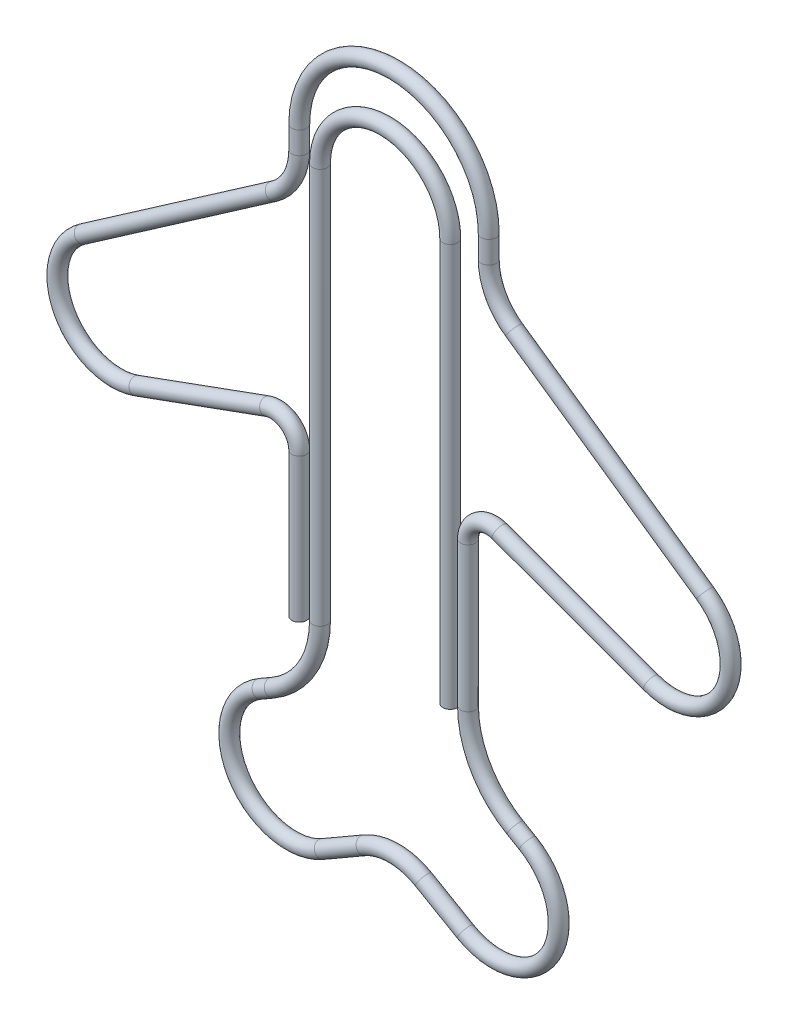
ISO-10303-21;
HEADER;
FILE_DESCRIPTION(('STEP AP214'),'2;1');
FILE_NAME('part.step','',(''),(''),'','','');
FILE_SCHEMA(('AUTOMOTIVE_DESIGN { 1 0 10303 214 1 1 1 1 }'));
ENDSEC;
DATA;
#1=APPLICATION_CONTEXT('core data for automotive mechanical design processes');
#2=APPLICATION_PROTOCOL_DEFINITION('international standard','automotive_design',2000,#1);
#3=PRODUCT_CONTEXT('',#1,'mechanical');
#4=PRODUCT('Part','Part','',(#3));
#5=PRODUCT_RELATED_PRODUCT_CATEGORY('part','',(#4));
#6=PRODUCT_DEFINITION_FORMATION('','',#4);
#7=PRODUCT_DEFINITION_CONTEXT('part definition',#1,'design');
#8=PRODUCT_DEFINITION('design','',#6,#7);
#9=PRODUCT_DEFINITION_SHAPE('','',#8);
#10=(LENGTH_UNIT() NAMED_UNIT(*) SI_UNIT(.MILLI.,.METRE.));
#11=(NAMED_UNIT(*) PLANE_ANGLE_UNIT() SI_UNIT($,.RADIAN.));
#12=(NAMED_UNIT(*) SI_UNIT($,.STERADIAN.) SOLID_ANGLE_UNIT());
#13=UNCERTAINTY_MEASURE_WITH_UNIT(LENGTH_MEASURE(1.E-05),#10,'distance_accuracy_value','');
#14=(GEOMETRIC_REPRESENTATION_CONTEXT(3) GLOBAL_UNCERTAINTY_ASSIGNED_CONTEXT((#13)) GLOBAL_UNIT_ASSIGNED_CONTEXT((#10,
#11,#12)) REPRESENTATION_CONTEXT('',''));
#15=CARTESIAN_POINT('',(0.,0.,0.));
#16=DIRECTION('',(0.,0.,1.));
#17=DIRECTION('',(1.,0.,0.));
#18=AXIS2_PLACEMENT_3D('',#15,#16,#17);
#19=CARTESIAN_POINT('',(-16.0000000000002,12.2874079730314,0.));
#20=DIRECTION('',(0.,-1.,0.));
#21=DIRECTION('',(1.,0.,0.));
#22=AXIS2_PLACEMENT_3D('',#19,#20,#21);
#23=CYLINDRICAL_SURFACE('',#22,1.25);
#24=CARTESIAN_POINT('',(-16.0000000000002,12.2874079730314,0.));
#25=DIRECTION('',(0.,1.,0.));
#26=DIRECTION('',(-1.,0.,0.));
#27=AXIS2_PLACEMENT_3D('',#24,#25,#26);
#28=CIRCLE('',#27,1.25);
#29=CARTESIAN_POINT('',(-14.7500000000002,12.2874079730314,0.));
#30=VERTEX_POINT('',#29);
#31=EDGE_CURVE('E39',#30,#30,#28,.T.);
#32=CARTESIAN_POINT('',(-16.,-12.0000000000001,0.));
#33=DIRECTION('',(0.,1.,0.));
#34=DIRECTION('',(-1.,0.,0.));
#35=AXIS2_PLACEMENT_3D('',#32,#33,#34);
#36=CIRCLE('',#35,1.25);
#37=CARTESIAN_POINT('',(-14.75,-12.0000000000002,0.));
#38=VERTEX_POINT('',#37);
#39=EDGE_CURVE('E10',#38,#38,#36,.T.);
#40=CARTESIAN_POINT('',(-14.7500000000002,12.2874079730314,0.));
#41=CARTESIAN_POINT('',(-14.7500000000002,12.034414139979,0.));
#42=CARTESIAN_POINT('',(-14.7500000000002,11.7814203069265,0.));
#43=CARTESIAN_POINT('',(-14.7500000000002,11.2754326408217,0.));
#44=CARTESIAN_POINT('',(-14.7500000000002,11.0224388077693,0.));
#45=CARTESIAN_POINT('',(-14.7500000000002,10.5164511416645,0.));
#46=CARTESIAN_POINT('',(-14.7500000000002,10.2634573086121,0.));
#47=CARTESIAN_POINT('',(-14.7500000000001,9.75746964250725,0.));
#48=CARTESIAN_POINT('',(-14.7500000000001,9.50447580945484,0.));
#49=CARTESIAN_POINT('',(-14.7500000000001,8.99848814335001,0.));
#50=CARTESIAN_POINT('',(-14.7500000000001,8.7454943102976,0.));
#51=CARTESIAN_POINT('',(-14.7500000000001,8.23950664419278,0.));
#52=CARTESIAN_POINT('',(-14.7500000000001,7.98651281114036,0.));
#53=CARTESIAN_POINT('',(-14.7500000000001,7.48052514503554,0.));
#54=CARTESIAN_POINT('',(-14.7500000000001,7.22753131198313,0.));
#55=CARTESIAN_POINT('',(-14.7500000000001,6.7215436458783,0.));
#56=CARTESIAN_POINT('',(-14.7500000000001,6.46854981282589,0.));
#57=CARTESIAN_POINT('',(-14.7500000000001,5.96256214672106,0.));
#58=CARTESIAN_POINT('',(-14.7500000000001,5.70956831366865,0.));
#59=CARTESIAN_POINT('',(-14.7500000000001,5.20358064756383,0.));
#60=CARTESIAN_POINT('',(-14.7500000000001,4.95058681451142,0.));
#61=CARTESIAN_POINT('',(-14.7500000000001,4.44459914840659,0.));
#62=CARTESIAN_POINT('',(-14.7500000000001,4.19160531535418,0.));
#63=CARTESIAN_POINT('',(-14.7500000000001,3.68561764924935,0.));
#64=CARTESIAN_POINT('',(-14.7500000000001,3.43262381619694,0.));
#65=CARTESIAN_POINT('',(-14.7500000000001,2.92663615009212,0.));
#66=CARTESIAN_POINT('',(-14.7500000000001,2.6736423170397,0.));
#67=CARTESIAN_POINT('',(-14.7500000000001,2.16765465093488,0.));
#68=CARTESIAN_POINT('',(-14.7500000000001,1.91466081788247,0.));
#69=CARTESIAN_POINT('',(-14.7500000000001,1.40867315177764,0.));
#70=CARTESIAN_POINT('',(-14.7500000000001,1.15567931872523,0.));
#71=CARTESIAN_POINT('',(-14.7500000000001,0.649691652620404,0.));
#72=CARTESIAN_POINT('',(-14.7500000000001,0.396697819567992,0.));
#73=CARTESIAN_POINT('',(-14.7500000000001,-0.109289846536833,0.));
#74=CARTESIAN_POINT('',(-14.7500000000001,-0.362283679589245,0.));
#75=CARTESIAN_POINT('',(-14.7500000000001,-0.86827134569407,0.));
#76=CARTESIAN_POINT('',(-14.7500000000001,-1.12126517874648,0.));
#77=CARTESIAN_POINT('',(-14.7500000000001,-1.62725284485131,0.));
#78=CARTESIAN_POINT('',(-14.7500000000001,-1.88024667790372,0.));
#79=CARTESIAN_POINT('',(-14.7500000000001,-2.38623434400854,0.));
#80=CARTESIAN_POINT('',(-14.7500000000001,-2.63922817706096,0.));
#81=CARTESIAN_POINT('',(-14.7500000000001,-3.14521584316578,0.));
#82=CARTESIAN_POINT('',(-14.7500000000001,-3.39820967621819,0.));
#83=CARTESIAN_POINT('',(-14.7500000000001,-3.90419734232301,0.));
#84=CARTESIAN_POINT('',(-14.7500000000001,-4.15719117537543,0.));
#85=CARTESIAN_POINT('',(-14.7500000000001,-4.66317884148025,0.));
#86=CARTESIAN_POINT('',(-14.7500000000001,-4.91617267453267,0.));
#87=CARTESIAN_POINT('',(-14.7500000000001,-5.42216034063749,0.));
#88=CARTESIAN_POINT('',(-14.7500000000001,-5.6751541736899,0.));
#89=CARTESIAN_POINT('',(-14.7500000000001,-6.18114183979473,0.));
#90=CARTESIAN_POINT('',(-14.7500000000001,-6.43413567284714,0.));
#91=CARTESIAN_POINT('',(-14.7500000000001,-6.94012333895196,0.));
#92=CARTESIAN_POINT('',(-14.7500000000001,-7.19311717200438,0.));
#93=CARTESIAN_POINT('',(-14.7500000000001,-7.6991048381092,0.));
#94=CARTESIAN_POINT('',(-14.7500000000001,-7.95209867116161,0.));
#95=CARTESIAN_POINT('',(-14.7500000000001,-8.45808633726644,0.));
#96=CARTESIAN_POINT('',(-14.7500000000001,-8.71108017031885,0.));
#97=CARTESIAN_POINT('',(-14.75,-9.21706783642367,0.));
#98=CARTESIAN_POINT('',(-14.75,-9.47006166947609,0.));
#99=CARTESIAN_POINT('',(-14.75,-9.97604933558091,0.));
#100=CARTESIAN_POINT('',(-14.75,-10.2290431686333,0.));
#101=CARTESIAN_POINT('',(-14.75,-10.7350308347381,0.));
#102=CARTESIAN_POINT('',(-14.75,-10.9880246677906,0.));
#103=CARTESIAN_POINT('',(-14.75,-11.4940123338954,0.));
#104=CARTESIAN_POINT('',(-14.75,-11.7470061669478,0.));
#105=CARTESIAN_POINT('',(-14.75,-12.0000000000002,0.));
#106=B_SPLINE_CURVE_WITH_KNOTS('',3,(#40,#41,#42,#43,#44,#45,#46,#47,#48,#49,#50,#51,#52,#53,
#54,#55,#56,#57,#58,#59,#60,#61,#62,#63,#64,#65,#66,#67,#68,#69,#70,#71,#72,#73,#74,#75,#76,#77,
#78,#79,#80,#81,#82,#83,#84,#85,#86,#87,#88,#89,#90,#91,#92,#93,#94,#95,#96,#97,#98,#99,#100,
#101,#102,#103,#104,#105),.UNSPECIFIED.,.F.,.F.,(4,2,2,2,2,2,2,2,2,2,2,2,2,2,2,2,2,2,2,2,2,2,2,
2,2,2,2,2,2,2,2,2,4),(0.,0.758981499157235,1.51796299831447,2.27694449747171,3.03592599662895,
3.79490749578618,4.55388899494342,5.31287049410066,6.0718519932579,6.83083349241513,
7.58981499157237,8.34879649072961,9.10777798988684,9.86675948904408,10.6257409882013,
11.3847224873586,12.1437039865158,12.902685485673,13.6616669848303,14.4206484839875,
15.1796299831447,15.938611482302,16.6975929814592,17.4565744806165,18.2155559797737,
18.9745374789309,19.7335189780882,20.4925004772454,21.2514819764026,22.0104634755599,
22.7694449747171,23.5284264738743,24.2874079730316),.UNSPECIFIED.);
#107=EDGE_CURVE('BSEAM33',#30,#38,#106,.T.);
#108=ORIENTED_EDGE('',*,*,#31,.F.);
#109=ORIENTED_EDGE('',*,*,#39,.T.);
#110=ORIENTED_EDGE('',*,*,#107,.T.);
#111=ORIENTED_EDGE('',*,*,#107,.F.);
#112=EDGE_LOOP('',(#108,#110,#109,#111));
#113=FACE_BOUND('',#112,.T.);
#114=ADVANCED_FACE('F33',(#113),#23,.T.);
#115=CARTESIAN_POINT('',(-20.0000000000001,12.2874079730316,0.));
#116=DIRECTION('',(0.,0.,-1.));
#117=DIRECTION('',(-1.,0.,0.));
#118=AXIS2_PLACEMENT_3D('',#115,#116,#117);
#119=TOROIDAL_SURFACE('',#118,3.99999999999997,1.25);
#120=CARTESIAN_POINT('',(-21.3680805733027,16.0461784561752,0.));
#121=DIRECTION('',(-0.939692620785924,-0.342020143325625,0.));
#122=DIRECTION('',(0.342020143325625,-0.939692620785924,0.));
#123=AXIS2_PLACEMENT_3D('',#120,#121,#122);
#124=CIRCLE('',#123,1.25);
#125=CARTESIAN_POINT('',(-21.7956057524598,17.2207942321576,0.));
#126=VERTEX_POINT('',#125);
#127=EDGE_CURVE('E43',#126,#126,#124,.T.);
#128=CARTESIAN_POINT('',(-20.0000000000001,12.2874079730316,0.));
#129=DIRECTION('',(0.,0.,-1.));
#130=DIRECTION('',(-1.,0.,0.));
#131=AXIS2_PLACEMENT_3D('',#128,#129,#130);
#132=CIRCLE('',#131,5.24999999999997);
#133=EDGE_CURVE('',#126,#30,#132,.T.);
#134=ORIENTED_EDGE('',*,*,#127,.F.);
#135=ORIENTED_EDGE('',*,*,#31,.T.);
#136=ORIENTED_EDGE('',*,*,#133,.T.);
#137=ORIENTED_EDGE('',*,*,#133,.F.);
#138=EDGE_LOOP('',(#134,#136,#135,#137));
#139=FACE_BOUND('',#138,.T.);
#140=ADVANCED_FACE('F269',(#139),#119,.T.);
#141=CARTESIAN_POINT('',(-43.4469042028416,8.0101438474098,0.));
#142=DIRECTION('',(0.939692620785909,0.342020143325668,0.));
#143=DIRECTION('',(-0.342020143325668,0.939692620785909,0.));
#144=AXIS2_PLACEMENT_3D('',#141,#142,#143);
#145=CYLINDRICAL_SURFACE('',#144,1.25);
#146=CARTESIAN_POINT('',(-43.4469042028416,8.0101438474098,0.));
#147=DIRECTION('',(-0.939692620785924,-0.342020143325625,0.));
#148=DIRECTION('',(0.342020143325625,-0.939692620785924,0.));
#149=AXIS2_PLACEMENT_3D('',#146,#147,#148);
#150=CIRCLE('',#149,1.25);
#151=CARTESIAN_POINT('',(-43.0193790236845,6.83552807142742,0.));
#152=VERTEX_POINT('',#151);
#153=EDGE_CURVE('E47',#152,#152,#150,.T.);
#154=ORIENTED_EDGE('',*,*,#153,.F.);
#155=EDGE_LOOP('',(#154));
#156=FACE_BOUND('',#155,.T.);
#157=ORIENTED_EDGE('',*,*,#127,.T.);
#158=EDGE_LOOP('',(#157));
#159=FACE_BOUND('',#158,.T.);
#160=ADVANCED_FACE('F263',(#156,#159),#145,.T.);
#161=CARTESIAN_POINT('',(-46.8671056360984,17.4070700552689,0.));
#162=DIRECTION('',(0.,0.,1.));
#163=DIRECTION('',(1.,0.,0.));
#164=AXIS2_PLACEMENT_3D('',#161,#162,#163);
#165=TOROIDAL_SURFACE('',#164,10.,1.25);
#166=CARTESIAN_POINT('',(-52.5684350853532,25.6225945370692,0.));
#167=DIRECTION('',(0.821552448180062,0.570132944925433,0.));
#168=DIRECTION('',(-0.570132944925433,0.821552448180062,0.));
#169=AXIS2_PLACEMENT_3D('',#166,#167,#168);
#170=CIRCLE('',#169,1.25);
#171=CARTESIAN_POINT('',(-53.2811012665101,26.6495350972942,0.));
#172=VERTEX_POINT('',#171);
#173=EDGE_CURVE('E52',#172,#172,#170,.T.);
#174=CARTESIAN_POINT('',(-46.8671056360984,17.4070700552689,0.));
#175=DIRECTION('',(0.,0.,1.));
#176=DIRECTION('',(1.,0.,0.));
#177=AXIS2_PLACEMENT_3D('',#174,#175,#176);
#178=CIRCLE('',#177,11.25);
#179=EDGE_CURVE('',#172,#152,#178,.T.);
#180=ORIENTED_EDGE('',*,*,#173,.F.);
#181=ORIENTED_EDGE('',*,*,#153,.T.);
#182=ORIENTED_EDGE('',*,*,#179,.T.);
#183=ORIENTED_EDGE('',*,*,#179,.F.);
#184=EDGE_LOOP('',(#180,#182,#181,#183));
#185=FACE_BOUND('',#184,.T.);
#186=ADVANCED_FACE('F257',(#185),#165,.T.);
#187=CARTESIAN_POINT('',(-20.2986705507455,48.016850590866,0.));
#188=DIRECTION('',(-0.821552448180037,-0.570132944925469,0.));
#189=DIRECTION('',(0.570132944925469,-0.821552448180037,0.));
#190=AXIS2_PLACEMENT_3D('',#187,#188,#189);
#191=CYLINDRICAL_SURFACE('',#190,1.25);
#192=CARTESIAN_POINT('',(-20.2986705507455,48.016850590866,0.));
#193=DIRECTION('',(0.821552448180062,0.570132944925433,0.));
#194=DIRECTION('',(-0.570132944925433,0.821552448180062,0.));
#195=AXIS2_PLACEMENT_3D('',#192,#193,#194);
#196=CIRCLE('',#195,1.25);
#197=CARTESIAN_POINT('',(-19.5860043695887,46.9899100306409,0.));
#198=VERTEX_POINT('',#197);
#199=EDGE_CURVE('E55',#198,#198,#196,.T.);
#200=ORIENTED_EDGE('',*,*,#199,.F.);
#201=EDGE_LOOP('',(#200));
#202=FACE_BOUND('',#201,.T.);
#203=ORIENTED_EDGE('',*,*,#173,.T.);
#204=EDGE_LOOP('',(#203));
#205=FACE_BOUND('',#204,.T.);
#206=ADVANCED_FACE('F251',(#202,#205),#191,.T.);
#207=CARTESIAN_POINT('',(-26.,56.2323750726664,0.));
#208=DIRECTION('',(0.,0.,-1.));
#209=DIRECTION('',(-1.,0.,0.));
#210=AXIS2_PLACEMENT_3D('',#207,#208,#209);
#211=TOROIDAL_SURFACE('',#210,9.99999999999997,1.25);
#212=CARTESIAN_POINT('',(-16.,56.2323750726663,0.));
#213=DIRECTION('',(0.,1.,0.));
#214=DIRECTION('',(-1.,0.,0.));
#215=AXIS2_PLACEMENT_3D('',#212,#213,#214);
#216=CIRCLE('',#215,1.25);
#217=CARTESIAN_POINT('',(-14.75,56.2323750726663,0.));
#218=VERTEX_POINT('',#217);
#219=EDGE_CURVE('E58',#218,#218,#216,.T.);
#220=CARTESIAN_POINT('',(-26.,56.2323750726664,0.));
#221=DIRECTION('',(0.,0.,-1.));
#222=DIRECTION('',(-1.,0.,0.));
#223=AXIS2_PLACEMENT_3D('',#220,#221,#222);
#224=CIRCLE('',#223,11.25);
#225=EDGE_CURVE('',#218,#198,#224,.T.);
#226=ORIENTED_EDGE('',*,*,#219,.F.);
#227=ORIENTED_EDGE('',*,*,#199,.T.);
#228=ORIENTED_EDGE('',*,*,#225,.T.);
#229=ORIENTED_EDGE('',*,*,#225,.F.);
#230=EDGE_LOOP('',(#226,#228,#227,#229));
#231=FACE_BOUND('',#230,.T.);
#232=ADVANCED_FACE('F245',(#231),#211,.T.);
#233=CARTESIAN_POINT('',(-16.,59.9999999999999,0.));
#234=DIRECTION('',(0.,-1.,0.));
#235=DIRECTION('',(1.,0.,0.));
#236=AXIS2_PLACEMENT_3D('',#233,#234,#235);
#237=CYLINDRICAL_SURFACE('',#236,1.25);
#238=CARTESIAN_POINT('',(-16.,59.9999999999999,0.));
#239=DIRECTION('',(0.,1.,0.));
#240=DIRECTION('',(-1.,0.,0.));
#241=AXIS2_PLACEMENT_3D('',#238,#239,#240);
#242=CIRCLE('',#241,1.25);
#243=CARTESIAN_POINT('',(-17.25,59.9999999999998,0.));
#244=VERTEX_POINT('',#243);
#245=EDGE_CURVE('E61',#244,#244,#242,.T.);
#246=ORIENTED_EDGE('',*,*,#245,.F.);
#247=EDGE_LOOP('',(#246));
#248=FACE_BOUND('',#247,.T.);
#249=ORIENTED_EDGE('',*,*,#219,.T.);
#250=EDGE_LOOP('',(#249));
#251=FACE_BOUND('',#250,.T.);
#252=ADVANCED_FACE('F239',(#248,#251),#237,.T.);
#253=CARTESIAN_POINT('',(0.,60.,0.));
#254=DIRECTION('',(0.,0.,1.));
#255=DIRECTION('',(1.,0.,0.));
#256=AXIS2_PLACEMENT_3D('',#253,#254,#255);
#257=TOROIDAL_SURFACE('',#256,16.,1.25);
#258=CARTESIAN_POINT('',(16.,60.0000000000001,0.));
#259=DIRECTION('',(0.,-1.,0.));
#260=DIRECTION('',(1.,0.,0.));
#261=AXIS2_PLACEMENT_3D('',#258,#259,#260);
#262=CIRCLE('',#261,1.25);
#263=CARTESIAN_POINT('',(17.25,60.0000000000002,0.));
#264=VERTEX_POINT('',#263);
#265=EDGE_CURVE('E64',#264,#264,#262,.T.);
#266=CARTESIAN_POINT('',(0.,60.,0.));
#267=DIRECTION('',(0.,0.,1.));
#268=DIRECTION('',(1.,0.,0.));
#269=AXIS2_PLACEMENT_3D('',#266,#267,#268);
#270=CIRCLE('',#269,17.25);
#271=EDGE_CURVE('',#264,#244,#270,.T.);
#272=ORIENTED_EDGE('',*,*,#265,.F.);
#273=ORIENTED_EDGE('',*,*,#245,.T.);
#274=ORIENTED_EDGE('',*,*,#271,.T.);
#275=ORIENTED_EDGE('',*,*,#271,.F.);
#276=EDGE_LOOP('',(#272,#274,#273,#275));
#277=FACE_BOUND('',#276,.T.);
#278=ADVANCED_FACE('F233',(#277),#257,.T.);
#279=CARTESIAN_POINT('',(16.,56.2323750726666,0.));
#280=DIRECTION('',(0.,1.,0.));
#281=DIRECTION('',(-1.,0.,0.));
#282=AXIS2_PLACEMENT_3D('',#279,#280,#281);
#283=CYLINDRICAL_SURFACE('',#282,1.25);
#284=CARTESIAN_POINT('',(16.,56.2323750726666,0.));
#285=DIRECTION('',(0.,-1.,0.));
#286=DIRECTION('',(1.,0.,0.));
#287=AXIS2_PLACEMENT_3D('',#284,#285,#286);
#288=CIRCLE('',#287,1.25);
#289=CARTESIAN_POINT('',(14.75,56.2323750726666,0.));
#290=VERTEX_POINT('',#289);
#291=EDGE_CURVE('E67',#290,#290,#288,.T.);
#292=ORIENTED_EDGE('',*,*,#291,.F.);
#293=EDGE_LOOP('',(#292));
#294=FACE_BOUND('',#293,.T.);
#295=ORIENTED_EDGE('',*,*,#265,.T.);
#296=EDGE_LOOP('',(#295));
#297=FACE_BOUND('',#296,.T.);
#298=ADVANCED_FACE('F227',(#294,#297),#283,.T.);
#299=CARTESIAN_POINT('',(26.,56.2323750726664,0.));
#300=DIRECTION('',(0.,0.,-1.));
#301=DIRECTION('',(-1.,0.,0.));
#302=AXIS2_PLACEMENT_3D('',#299,#300,#301);
#303=TOROIDAL_SURFACE('',#302,9.99999999999997,1.25);
#304=CARTESIAN_POINT('',(20.2986705507452,48.0168505908662,0.));
#305=DIRECTION('',(0.821552448180022,-0.570132944925491,0.));
#306=DIRECTION('',(0.570132944925491,0.821552448180022,0.));
#307=AXIS2_PLACEMENT_3D('',#304,#305,#306);
#308=CIRCLE('',#307,1.25);
#309=CARTESIAN_POINT('',(19.5860043695884,46.9899100306411,0.));
#310=VERTEX_POINT('',#309);
#311=EDGE_CURVE('E70',#310,#310,#308,.T.);
#312=CARTESIAN_POINT('',(26.,56.2323750726664,0.));
#313=DIRECTION('',(0.,0.,-1.));
#314=DIRECTION('',(-1.,0.,0.));
#315=AXIS2_PLACEMENT_3D('',#312,#313,#314);
#316=CIRCLE('',#315,11.25);
#317=EDGE_CURVE('',#310,#290,#316,.T.);
#318=ORIENTED_EDGE('',*,*,#311,.F.);
#319=ORIENTED_EDGE('',*,*,#291,.T.);
#320=ORIENTED_EDGE('',*,*,#317,.T.);
#321=ORIENTED_EDGE('',*,*,#317,.F.);
#322=EDGE_LOOP('',(#318,#320,#319,#321));
#323=FACE_BOUND('',#322,.T.);
#324=ADVANCED_FACE('F221',(#323),#303,.T.);
#325=CARTESIAN_POINT('',(52.568435085353,25.6225945370694,0.));
#326=DIRECTION('',(-0.821552448180037,0.570132944925469,0.));
#327=DIRECTION('',(-0.570132944925469,-0.821552448180037,0.));
#328=AXIS2_PLACEMENT_3D('',#325,#326,#327);
#329=CYLINDRICAL_SURFACE('',#328,1.25);
#330=CARTESIAN_POINT('',(52.568435085353,25.6225945370694,0.));
#331=DIRECTION('',(0.821552448180022,-0.570132944925491,0.));
#332=DIRECTION('',(0.570132944925491,0.821552448180022,0.));
#333=AXIS2_PLACEMENT_3D('',#330,#331,#332);
#334=CIRCLE('',#333,1.25);
#335=CARTESIAN_POINT('',(53.2811012665098,26.6495350972944,0.));
#336=VERTEX_POINT('',#335);
#337=EDGE_CURVE('E73',#336,#336,#334,.T.);
#338=ORIENTED_EDGE('',*,*,#337,.F.);
#339=EDGE_LOOP('',(#338));
#340=FACE_BOUND('',#339,.T.);
#341=ORIENTED_EDGE('',*,*,#311,.T.);
#342=EDGE_LOOP('',(#341));
#343=FACE_BOUND('',#342,.T.);
#344=ADVANCED_FACE('F215',(#340,#343),#329,.T.);
#345=CARTESIAN_POINT('',(46.8671056360984,17.4070700552689,0.));
#346=DIRECTION('',(0.,0.,1.));
#347=DIRECTION('',(1.,0.,0.));
#348=AXIS2_PLACEMENT_3D('',#345,#346,#347);
#349=TOROIDAL_SURFACE('',#348,10.,1.25);
#350=CARTESIAN_POINT('',(43.4469042028418,8.01014384740972,0.));
#351=DIRECTION('',(-0.9396926207859,0.342020143325692,0.));
#352=DIRECTION('',(-0.342020143325692,-0.9396926207859,0.));
#353=AXIS2_PLACEMENT_3D('',#350,#351,#352);
#354=CIRCLE('',#353,1.25);
#355=CARTESIAN_POINT('',(43.0193790236848,6.83552807142732,0.));
#356=VERTEX_POINT('',#355);
#357=EDGE_CURVE('E76',#356,#356,#354,.T.);
#358=CARTESIAN_POINT('',(46.8671056360984,17.4070700552689,0.));
#359=DIRECTION('',(0.,0.,1.));
#360=DIRECTION('',(1.,0.,0.));
#361=AXIS2_PLACEMENT_3D('',#358,#359,#360);
#362=CIRCLE('',#361,11.25);
#363=EDGE_CURVE('',#356,#336,#362,.T.);
#364=ORIENTED_EDGE('',*,*,#357,.F.);
#365=ORIENTED_EDGE('',*,*,#337,.T.);
#366=ORIENTED_EDGE('',*,*,#363,.T.);
#367=ORIENTED_EDGE('',*,*,#363,.F.);
#368=EDGE_LOOP('',(#364,#366,#365,#367));
#369=FACE_BOUND('',#368,.T.);
#370=ADVANCED_FACE('F209',(#369),#349,.T.);
#371=CARTESIAN_POINT('',(17.8680805733028,17.3200742761068,0.));
#372=DIRECTION('',(0.93969262078591,-0.342020143325665,0.));
#373=DIRECTION('',(0.342020143325665,0.93969262078591,0.));
#374=AXIS2_PLACEMENT_3D('',#371,#372,#373);
#375=CYLINDRICAL_SURFACE('',#374,1.25);
#376=CARTESIAN_POINT('',(17.8680805733028,17.3200742761068,0.));
#377=DIRECTION('',(-0.9396926207859,0.342020143325692,0.));
#378=DIRECTION('',(-0.342020143325692,-0.9396926207859,0.));
#379=AXIS2_PLACEMENT_3D('',#376,#377,#378);
#380=CIRCLE('',#379,1.25);
#381=CARTESIAN_POINT('',(18.29560575246,18.4946900520892,0.));
#382=VERTEX_POINT('',#381);
#383=EDGE_CURVE('E79',#382,#382,#380,.T.);
#384=ORIENTED_EDGE('',*,*,#383,.F.);
#385=EDGE_LOOP('',(#384));
#386=FACE_BOUND('',#385,.T.);
#387=ORIENTED_EDGE('',*,*,#357,.T.);
#388=EDGE_LOOP('',(#387));
#389=FACE_BOUND('',#388,.T.);
#390=ADVANCED_FACE('F203',(#386,#389),#375,.T.);
#391=CARTESIAN_POINT('',(16.5,13.5613037929633,0.));
#392=DIRECTION('',(0.,0.,-1.));
#393=DIRECTION('',(-1.,0.,0.));
#394=AXIS2_PLACEMENT_3D('',#391,#392,#393);
#395=TOROIDAL_SURFACE('',#394,3.99999999999997,1.25);
#396=CARTESIAN_POINT('',(12.5,13.5613037929634,0.));
#397=DIRECTION('',(0.,-1.,0.));
#398=DIRECTION('',(1.,0.,0.));
#399=AXIS2_PLACEMENT_3D('',#396,#397,#398);
#400=CIRCLE('',#399,1.25);
#401=CARTESIAN_POINT('',(11.25,13.5613037929634,0.));
#402=VERTEX_POINT('',#401);
#403=EDGE_CURVE('E82',#402,#402,#400,.T.);
#404=CARTESIAN_POINT('',(16.5,13.5613037929633,0.));
#405=DIRECTION('',(0.,0.,-1.));
#406=DIRECTION('',(-1.,0.,0.));
#407=AXIS2_PLACEMENT_3D('',#404,#405,#406);
#408=CIRCLE('',#407,5.24999999999997);
#409=EDGE_CURVE('',#402,#382,#408,.T.);
#410=ORIENTED_EDGE('',*,*,#403,.F.);
#411=ORIENTED_EDGE('',*,*,#383,.T.);
#412=ORIENTED_EDGE('',*,*,#409,.T.);
#413=ORIENTED_EDGE('',*,*,#409,.F.);
#414=EDGE_LOOP('',(#410,#412,#411,#413));
#415=FACE_BOUND('',#414,.T.);
#416=ADVANCED_FACE('F197',(#415),#395,.T.);
#417=CARTESIAN_POINT('',(12.5,-10.8549184048539,0.));
#418=DIRECTION('',(0.,1.,0.));
#419=DIRECTION('',(-1.,0.,0.));
#420=AXIS2_PLACEMENT_3D('',#417,#418,#419);
#421=CYLINDRICAL_SURFACE('',#420,1.25);
#422=CARTESIAN_POINT('',(12.5,-10.8549184048539,0.));
#423=DIRECTION('',(0.,-1.,0.));
#424=DIRECTION('',(1.,0.,0.));
#425=AXIS2_PLACEMENT_3D('',#422,#423,#424);
#426=CIRCLE('',#425,1.25);
#427=CARTESIAN_POINT('',(11.25,-10.8549184048539,0.));
#428=VERTEX_POINT('',#427);
#429=EDGE_CURVE('E85',#428,#428,#426,.T.);
#430=ORIENTED_EDGE('',*,*,#429,.F.);
#431=EDGE_LOOP('',(#430));
#432=FACE_BOUND('',#431,.T.);
#433=ORIENTED_EDGE('',*,*,#403,.T.);
#434=EDGE_LOOP('',(#433));
#435=FACE_BOUND('',#434,.T.);
#436=ADVANCED_FACE('F191',(#432,#435),#421,.T.);
#437=CARTESIAN_POINT('',(28.5,-10.8549184048541,0.));
#438=DIRECTION('',(0.,0.,-1.));
#439=DIRECTION('',(-1.,0.,0.));
#440=AXIS2_PLACEMENT_3D('',#437,#438,#439);
#441=TOROIDAL_SURFACE('',#440,16.,1.25);
#442=CARTESIAN_POINT('',(20.5,-24.7113248654051,0.));
#443=DIRECTION('',(0.866025403784441,-0.499999999999996,0.));
#444=DIRECTION('',(0.499999999999996,0.866025403784441,0.));
#445=AXIS2_PLACEMENT_3D('',#442,#443,#444);
#446=CIRCLE('',#445,1.25);
#447=CARTESIAN_POINT('',(19.875,-25.7938566201356,0.));
#448=VERTEX_POINT('',#447);
#449=EDGE_CURVE('E88',#448,#448,#446,.T.);
#450=CARTESIAN_POINT('',(28.5,-10.8549184048541,0.));
#451=DIRECTION('',(0.,0.,-1.));
#452=DIRECTION('',(-1.,0.,0.));
#453=AXIS2_PLACEMENT_3D('',#450,#451,#452);
#454=CIRCLE('',#453,17.25);
#455=EDGE_CURVE('',#448,#428,#454,.T.);
#456=ORIENTED_EDGE('',*,*,#449,.F.);
#457=ORIENTED_EDGE('',*,*,#429,.T.);
#458=ORIENTED_EDGE('',*,*,#455,.T.);
#459=ORIENTED_EDGE('',*,*,#455,.F.);
#460=EDGE_LOOP('',(#456,#458,#457,#459));
#461=FACE_BOUND('',#460,.T.);
#462=ADVANCED_FACE('F185',(#461),#441,.T.);
#463=CARTESIAN_POINT('',(22.5705080756887,-25.9067332602632,0.));
#464=DIRECTION('',(-0.866025403784439,0.499999999999999,0.));
#465=DIRECTION('',(-0.499999999999999,-0.866025403784439,0.));
#466=AXIS2_PLACEMENT_3D('',#463,#464,#465);
#467=CYLINDRICAL_SURFACE('',#466,1.25);
#468=CARTESIAN_POINT('',(22.5705080756887,-25.9067332602632,0.));
#469=DIRECTION('',(0.866025403784441,-0.499999999999996,0.));
#470=DIRECTION('',(0.499999999999996,0.866025403784441,0.));
#471=AXIS2_PLACEMENT_3D('',#468,#469,#470);
#472=CIRCLE('',#471,1.25);
#473=CARTESIAN_POINT('',(23.1955080756886,-24.8242015055327,0.));
#474=VERTEX_POINT('',#473);
#475=EDGE_CURVE('E91',#474,#474,#472,.T.);
#476=ORIENTED_EDGE('',*,*,#475,.F.);
#477=EDGE_LOOP('',(#476));
#478=FACE_BOUND('',#477,.T.);
#479=ORIENTED_EDGE('',*,*,#449,.T.);
#480=EDGE_LOOP('',(#479));
#481=FACE_BOUND('',#480,.T.);
#482=ADVANCED_FACE('F179',(#478,#481),#467,.T.);
#483=CARTESIAN_POINT('',(17.3205080756888,-35.,0.));
#484=DIRECTION('',(0.,0.,1.));
#485=DIRECTION('',(1.,0.,0.));
#486=AXIS2_PLACEMENT_3D('',#483,#484,#485);
#487=TOROIDAL_SURFACE('',#486,10.5,1.25);
#488=CARTESIAN_POINT('',(12.0705080756888,-44.0932667397366,0.));
#489=DIRECTION('',(-0.866025403784434,0.500000000000008,0.));
#490=DIRECTION('',(-0.500000000000008,-0.866025403784434,0.));
#491=AXIS2_PLACEMENT_3D('',#488,#489,#490);
#492=CIRCLE('',#491,1.25);
#493=CARTESIAN_POINT('',(11.4455080756888,-45.1757984944671,0.));
#494=VERTEX_POINT('',#493);
#495=EDGE_CURVE('E94',#494,#494,#492,.T.);
#496=CARTESIAN_POINT('',(17.3205080756888,-35.,0.));
#497=DIRECTION('',(0.,0.,1.));
#498=DIRECTION('',(1.,0.,0.));
#499=AXIS2_PLACEMENT_3D('',#496,#497,#498);
#500=CIRCLE('',#499,11.75);
#501=EDGE_CURVE('',#494,#474,#500,.T.);
#502=ORIENTED_EDGE('',*,*,#495,.F.);
#503=ORIENTED_EDGE('',*,*,#475,.T.);
#504=ORIENTED_EDGE('',*,*,#501,.T.);
#505=ORIENTED_EDGE('',*,*,#501,.F.);
#506=EDGE_LOOP('',(#502,#504,#503,#505));
#507=FACE_BOUND('',#506,.T.);
#508=ADVANCED_FACE('F173',(#507),#487,.T.);
#509=CARTESIAN_POINT('',(4.99999999999996,-40.0111069989302,0.));
#510=DIRECTION('',(0.86602540378444,-0.499999999999997,0.));
#511=DIRECTION('',(0.499999999999998,0.86602540378444,0.));
#512=AXIS2_PLACEMENT_3D('',#509,#510,#511);
#513=CYLINDRICAL_SURFACE('',#512,1.25);
#514=CARTESIAN_POINT('',(4.99999999999996,-40.0111069989302,0.));
#515=DIRECTION('',(-0.866025403784434,0.500000000000008,0.));
#516=DIRECTION('',(-0.500000000000008,-0.866025403784434,0.));
#517=AXIS2_PLACEMENT_3D('',#514,#515,#516);
#518=CIRCLE('',#517,1.25);
#519=CARTESIAN_POINT('',(5.62499999999996,-38.9285752441997,0.));
#520=VERTEX_POINT('',#519);
#521=EDGE_CURVE('E97',#520,#520,#518,.T.);
#522=ORIENTED_EDGE('',*,*,#521,.F.);
#523=EDGE_LOOP('',(#522));
#524=FACE_BOUND('',#523,.T.);
#525=ORIENTED_EDGE('',*,*,#495,.T.);
#526=EDGE_LOOP('',(#525));
#527=FACE_BOUND('',#526,.T.);
#528=ADVANCED_FACE('F167',(#524,#527),#513,.T.);
#529=CARTESIAN_POINT('',(0.,-48.6713610367746,0.));
#530=DIRECTION('',(0.,0.,-1.));
#531=DIRECTION('',(-1.,0.,0.));
#532=AXIS2_PLACEMENT_3D('',#529,#530,#531);
#533=TOROIDAL_SURFACE('',#532,9.99999999999999,1.25);
#534=CARTESIAN_POINT('',(-4.99999999999998,-40.0111069989303,0.));
#535=DIRECTION('',(-0.866025403784445,-0.499999999999988,0.));
#536=DIRECTION('',(0.499999999999988,-0.866025403784445,0.));
#537=AXIS2_PLACEMENT_3D('',#534,#535,#536);
#538=CIRCLE('',#537,1.25);
#539=CARTESIAN_POINT('',(-5.62499999999998,-38.9285752441997,0.));
#540=VERTEX_POINT('',#539);
#541=EDGE_CURVE('E100',#540,#540,#538,.T.);
#542=CARTESIAN_POINT('',(0.,-48.6713610367746,0.));
#543=DIRECTION('',(0.,0.,-1.));
#544=DIRECTION('',(-1.,0.,0.));
#545=AXIS2_PLACEMENT_3D('',#542,#543,#544);
#546=CIRCLE('',#545,11.25);
#547=EDGE_CURVE('',#540,#520,#546,.T.);
#548=ORIENTED_EDGE('',*,*,#541,.F.);
#549=ORIENTED_EDGE('',*,*,#521,.T.);
#550=ORIENTED_EDGE('',*,*,#547,.T.);
#551=ORIENTED_EDGE('',*,*,#547,.F.);
#552=EDGE_LOOP('',(#548,#550,#549,#551));
#553=FACE_BOUND('',#552,.T.);
#554=ADVANCED_FACE('F161',(#553),#533,.T.);
#555=CARTESIAN_POINT('',(-12.0705080756888,-44.0932667397366,0.));
#556=DIRECTION('',(0.866025403784439,0.499999999999998,0.));
#557=DIRECTION('',(-0.499999999999998,0.86602540378444,0.));
#558=AXIS2_PLACEMENT_3D('',#555,#556,#557);
#559=CYLINDRICAL_SURFACE('',#558,1.25);
#560=CARTESIAN_POINT('',(-12.0705080756888,-44.0932667397366,0.));
#561=DIRECTION('',(-0.866025403784445,-0.499999999999988,0.));
#562=DIRECTION('',(0.499999999999988,-0.866025403784445,0.));
#563=AXIS2_PLACEMENT_3D('',#560,#561,#562);
#564=CIRCLE('',#563,1.25);
#565=CARTESIAN_POINT('',(-11.4455080756888,-45.1757984944671,0.));
#566=VERTEX_POINT('',#565);
#567=EDGE_CURVE('E103',#566,#566,#564,.T.);
#568=ORIENTED_EDGE('',*,*,#567,.F.);
#569=EDGE_LOOP('',(#568));
#570=FACE_BOUND('',#569,.T.);
#571=ORIENTED_EDGE('',*,*,#541,.T.);
#572=EDGE_LOOP('',(#571));
#573=FACE_BOUND('',#572,.T.);
#574=ADVANCED_FACE('F155',(#570,#573),#559,.T.);
#575=CARTESIAN_POINT('',(-17.3205080756888,-35.,0.));
#576=DIRECTION('',(0.,0.,1.));
#577=DIRECTION('',(1.,0.,0.));
#578=AXIS2_PLACEMENT_3D('',#575,#576,#577);
#579=TOROIDAL_SURFACE('',#578,10.5,1.25);
#580=CARTESIAN_POINT('',(-22.5705080756888,-25.9067332602633,0.));
#581=DIRECTION('',(0.866025403784445,0.499999999999989,0.));
#582=DIRECTION('',(-0.499999999999989,0.866025403784445,0.));
#583=AXIS2_PLACEMENT_3D('',#580,#581,#582);
#584=CIRCLE('',#583,1.25);
#585=CARTESIAN_POINT('',(-23.1955080756888,-24.8242015055328,0.));
#586=VERTEX_POINT('',#585);
#587=EDGE_CURVE('E106',#586,#586,#584,.T.);
#588=CARTESIAN_POINT('',(-17.3205080756888,-35.,0.));
#589=DIRECTION('',(0.,0.,1.));
#590=DIRECTION('',(1.,0.,0.));
#591=AXIS2_PLACEMENT_3D('',#588,#589,#590);
#592=CIRCLE('',#591,11.75);
#593=EDGE_CURVE('',#586,#566,#592,.T.);
#594=ORIENTED_EDGE('',*,*,#587,.F.);
#595=ORIENTED_EDGE('',*,*,#567,.T.);
#596=ORIENTED_EDGE('',*,*,#593,.T.);
#597=ORIENTED_EDGE('',*,*,#593,.F.);
#598=EDGE_LOOP('',(#594,#596,#595,#597));
#599=FACE_BOUND('',#598,.T.);
#600=ADVANCED_FACE('F149',(#599),#579,.T.);
#601=CARTESIAN_POINT('',(-20.5000000000001,-24.7113248654052,0.));
#602=DIRECTION('',(-0.866025403784441,-0.499999999999997,0.));
#603=DIRECTION('',(0.499999999999997,-0.866025403784441,0.));
#604=AXIS2_PLACEMENT_3D('',#601,#602,#603);
#605=CYLINDRICAL_SURFACE('',#604,1.25);
#606=CARTESIAN_POINT('',(-20.5000000000001,-24.7113248654052,0.));
#607=DIRECTION('',(0.866025403784445,0.499999999999989,0.));
#608=DIRECTION('',(-0.499999999999989,0.866025403784445,0.));
#609=AXIS2_PLACEMENT_3D('',#606,#607,#608);
#610=CIRCLE('',#609,1.25);
#611=CARTESIAN_POINT('',(-19.8750000000001,-25.7938566201358,0.));
#612=VERTEX_POINT('',#611);
#613=EDGE_CURVE('E109',#612,#612,#610,.T.);
#614=ORIENTED_EDGE('',*,*,#613,.F.);
#615=EDGE_LOOP('',(#614));
#616=FACE_BOUND('',#615,.T.);
#617=ORIENTED_EDGE('',*,*,#587,.T.);
#618=EDGE_LOOP('',(#617));
#619=FACE_BOUND('',#618,.T.);
#620=ADVANCED_FACE('F143',(#616,#619),#605,.T.);
#621=CARTESIAN_POINT('',(-28.5,-10.8549184048541,0.));
#622=DIRECTION('',(0.,0.,-1.));
#623=DIRECTION('',(-1.,0.,0.));
#624=AXIS2_PLACEMENT_3D('',#621,#622,#623);
#625=TOROIDAL_SURFACE('',#624,16.,1.25);
#626=CARTESIAN_POINT('',(-12.5,-10.8549184048541,0.));
#627=DIRECTION('',(0.,1.,0.));
#628=DIRECTION('',(-1.,0.,0.));
#629=AXIS2_PLACEMENT_3D('',#626,#627,#628);
#630=CIRCLE('',#629,1.25);
#631=CARTESIAN_POINT('',(-11.25,-10.854918404854,0.));
#632=VERTEX_POINT('',#631);
#633=EDGE_CURVE('E112',#632,#632,#630,.T.);
#634=CARTESIAN_POINT('',(-28.5,-10.8549184048541,0.));
#635=DIRECTION('',(0.,0.,-1.));
#636=DIRECTION('',(-1.,0.,0.));
#637=AXIS2_PLACEMENT_3D('',#634,#635,#636);
#638=CIRCLE('',#637,17.25);
#639=EDGE_CURVE('',#632,#612,#638,.T.);
#640=ORIENTED_EDGE('',*,*,#633,.F.);
#641=ORIENTED_EDGE('',*,*,#613,.T.);
#642=ORIENTED_EDGE('',*,*,#639,.T.);
#643=ORIENTED_EDGE('',*,*,#639,.F.);
#644=EDGE_LOOP('',(#640,#642,#641,#643));
#645=FACE_BOUND('',#644,.T.);
#646=ADVANCED_FACE('F137',(#645),#625,.T.);
#647=CARTESIAN_POINT('',(-12.5,56.,0.));
#648=DIRECTION('',(0.,-1.,0.));
#649=DIRECTION('',(1.,0.,0.));
#650=AXIS2_PLACEMENT_3D('',#647,#648,#649);
#651=CYLINDRICAL_SURFACE('',#650,1.25);
#652=CARTESIAN_POINT('',(-12.5,56.,0.));
#653=DIRECTION('',(0.,1.,0.));
#654=DIRECTION('',(-1.,0.,0.));
#655=AXIS2_PLACEMENT_3D('',#652,#653,#654);
#656=CIRCLE('',#655,1.25);
#657=CARTESIAN_POINT('',(-13.75,56.,0.));
#658=VERTEX_POINT('',#657);
#659=EDGE_CURVE('E115',#658,#658,#656,.T.);
#660=ORIENTED_EDGE('',*,*,#659,.F.);
#661=EDGE_LOOP('',(#660));
#662=FACE_BOUND('',#661,.T.);
#663=ORIENTED_EDGE('',*,*,#633,.T.);
#664=EDGE_LOOP('',(#663));
#665=FACE_BOUND('',#664,.T.);
#666=ADVANCED_FACE('F131',(#662,#665),#651,.T.);
#667=CARTESIAN_POINT('',(-1.5,56.,0.));
#668=DIRECTION('',(0.,0.,1.));
#669=DIRECTION('',(1.,0.,0.));
#670=AXIS2_PLACEMENT_3D('',#667,#668,#669);
#671=TOROIDAL_SURFACE('',#670,11.,1.25);
#672=CARTESIAN_POINT('',(9.5,56.,0.));
#673=DIRECTION('',(0.,-1.,0.));
#674=DIRECTION('',(1.,0.,0.));
#675=AXIS2_PLACEMENT_3D('',#672,#673,#674);
#676=CIRCLE('',#675,1.25);
#677=CARTESIAN_POINT('',(10.75,56.,0.));
#678=VERTEX_POINT('',#677);
#679=EDGE_CURVE('E118',#678,#678,#676,.T.);
#680=CARTESIAN_POINT('',(-1.5,56.,0.));
#681=DIRECTION('',(0.,0.,1.));
#682=DIRECTION('',(1.,0.,0.));
#683=AXIS2_PLACEMENT_3D('',#680,#681,#682);
#684=CIRCLE('',#683,12.25);
#685=EDGE_CURVE('',#678,#658,#684,.T.);
#686=ORIENTED_EDGE('',*,*,#679,.F.);
#687=ORIENTED_EDGE('',*,*,#659,.T.);
#688=ORIENTED_EDGE('',*,*,#685,.T.);
#689=ORIENTED_EDGE('',*,*,#685,.F.);
#690=EDGE_LOOP('',(#686,#688,#687,#689));
#691=FACE_BOUND('',#690,.T.);
#692=ADVANCED_FACE('F128',(#691),#671,.T.);
#693=CARTESIAN_POINT('',(9.5,56.,0.));
#694=DIRECTION('',(0.,-1.,0.));
#695=DIRECTION('',(1.,0.,0.));
#696=AXIS2_PLACEMENT_3D('',#693,#694,#695);
#697=CYLINDRICAL_SURFACE('',#696,1.25);
#698=ORIENTED_EDGE('',*,*,#679,.T.);
#699=EDGE_LOOP('',(#698));
#700=FACE_BOUND('',#699,.T.);
#701=CARTESIAN_POINT('',(9.50000000000001,-12.,0.));
#702=DIRECTION('',(0.,-1.,0.));
#703=DIRECTION('',(1.,0.,0.));
#704=AXIS2_PLACEMENT_3D('',#701,#702,#703);
#705=CIRCLE('',#704,1.25);
#706=CARTESIAN_POINT('',(10.75,-12.,0.));
#707=VERTEX_POINT('',#706);
#708=EDGE_CURVE('E119',#707,#707,#705,.T.);
#709=ORIENTED_EDGE('',*,*,#708,.F.);
#710=EDGE_LOOP('',(#709));
#711=FACE_BOUND('',#710,.T.);
#712=ADVANCED_FACE('F125',(#700,#711),#697,.T.);
#713=CARTESIAN_POINT('',(-16.,-12.0000000000001,0.));
#714=DIRECTION('',(0.,1.,0.));
#715=DIRECTION('',(-1.,0.,0.));
#716=AXIS2_PLACEMENT_3D('',#713,#714,#715);
#717=PLANE('',#716);
#718=ORIENTED_EDGE('',*,*,#39,.F.);
#719=EDGE_LOOP('',(#718));
#720=FACE_BOUND('',#719,.T.);
#721=ADVANCED_FACE('F281',(#720),#717,.F.);
#722=CARTESIAN_POINT('',(9.50000000000001,-12.,0.));
#723=DIRECTION('',(0.,-1.,0.));
#724=DIRECTION('',(1.,0.,0.));
#725=AXIS2_PLACEMENT_3D('',#722,#723,#724);
#726=PLANE('',#725);
#727=ORIENTED_EDGE('',*,*,#708,.T.);
#728=EDGE_LOOP('',(#727));
#729=FACE_BOUND('',#728,.T.);
#730=ADVANCED_FACE('F282',(#729),#726,.T.);
#731=CLOSED_SHELL('',(#114,#140,#160,#186,#206,#232,#252,#278,#298,#324,#344,#370,#390,#416,
#436,#462,#482,#508,#528,#554,#574,#600,#620,#646,#666,#692,#712,#721,#730));
#732=MANIFOLD_SOLID_BREP('B2',#731);
#733=ADVANCED_BREP_SHAPE_REPRESENTATION('',(#18,#732),#14);
#734=SHAPE_DEFINITION_REPRESENTATION(#9,#733);
ENDSEC;
END-ISO-10303-21;
